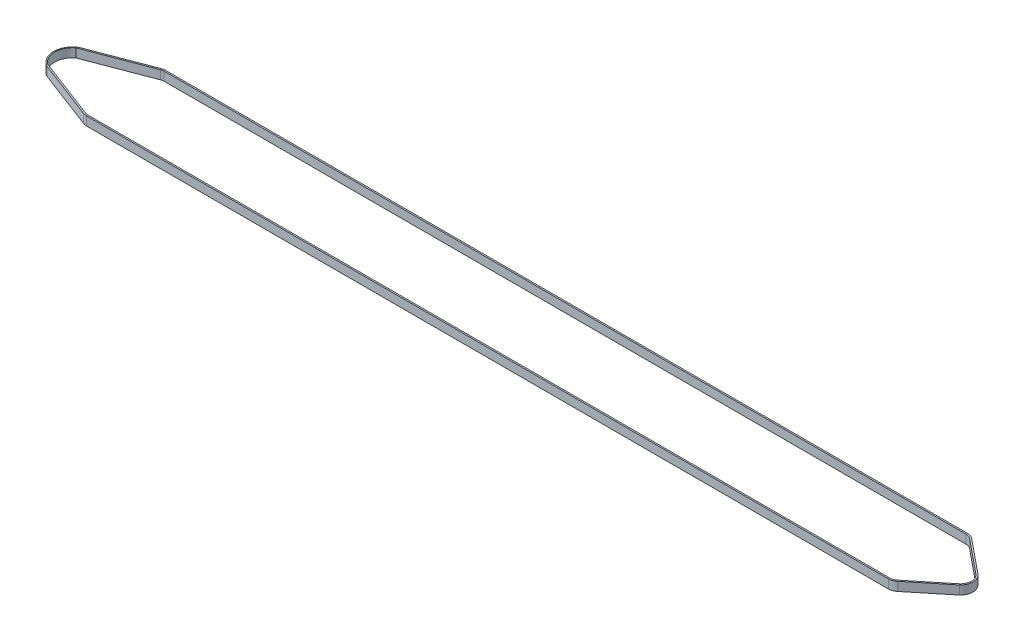
ISO-10303-21;
HEADER;
FILE_DESCRIPTION(('STEP AP214'),'2;1');
FILE_NAME('part.step','',(''),(''),'','','');
FILE_SCHEMA(('AUTOMOTIVE_DESIGN { 1 0 10303 214 1 1 1 1 }'));
ENDSEC;
DATA;
#1=APPLICATION_CONTEXT('core data for automotive mechanical design processes');
#2=APPLICATION_PROTOCOL_DEFINITION('international standard','automotive_design',2000,#1);
#3=PRODUCT_CONTEXT('',#1,'mechanical');
#4=PRODUCT('Part','Part','',(#3));
#5=PRODUCT_RELATED_PRODUCT_CATEGORY('part','',(#4));
#6=PRODUCT_DEFINITION_FORMATION('','',#4);
#7=PRODUCT_DEFINITION_CONTEXT('part definition',#1,'design');
#8=PRODUCT_DEFINITION('design','',#6,#7);
#9=PRODUCT_DEFINITION_SHAPE('','',#8);
#10=(LENGTH_UNIT() NAMED_UNIT(*) SI_UNIT(.MILLI.,.METRE.));
#11=(NAMED_UNIT(*) PLANE_ANGLE_UNIT() SI_UNIT($,.RADIAN.));
#12=(NAMED_UNIT(*) SI_UNIT($,.STERADIAN.) SOLID_ANGLE_UNIT());
#13=UNCERTAINTY_MEASURE_WITH_UNIT(LENGTH_MEASURE(1.E-05),#10,'distance_accuracy_value','');
#14=(GEOMETRIC_REPRESENTATION_CONTEXT(3) GLOBAL_UNCERTAINTY_ASSIGNED_CONTEXT((#13)) GLOBAL_UNIT_ASSIGNED_CONTEXT((#10,
#11,#12)) REPRESENTATION_CONTEXT('',''));
#15=CARTESIAN_POINT('',(0.,0.,0.));
#16=DIRECTION('',(0.,0.,1.));
#17=DIRECTION('',(1.,0.,0.));
#18=AXIS2_PLACEMENT_3D('',#15,#16,#17);
#19=CARTESIAN_POINT('',(-43.9258936534042,6.,-115.210808683554));
#20=DIRECTION('',(0.356250719323577,0.,0.934390402873143));
#21=DIRECTION('',(0.934390402873143,0.,-0.356250719323577));
#22=AXIS2_PLACEMENT_3D('',#19,#20,#21);
#23=PLANE('',#22);
#24=DIRECTION('',(-0.934390402873143,0.,0.356250719323577));
#25=VECTOR('',#24,1.);
#26=CARTESIAN_POINT('',(-43.9258936534042,0.,-115.210808683554));
#27=LINE('',#26,#25);
#28=CARTESIAN_POINT('',(-276.493755035265,0.,-26.540732820112));
#29=VERTEX_POINT('',#28);
#30=CARTESIAN_POINT('',(-317.199927226842,0.,-11.0208782929594));
#31=VERTEX_POINT('',#30);
#32=EDGE_CURVE('E267',#29,#31,#27,.T.);
#33=ORIENTED_EDGE('',*,*,#32,.T.);
#34=DIRECTION('',(0.,-1.,0.));
#35=VECTOR('',#34,1.);
#36=CARTESIAN_POINT('',(-317.199927226842,6.,-11.0208782929594));
#37=LINE('',#36,#35);
#38=CARTESIAN_POINT('',(-317.199927226842,6.,-11.0208782929594));
#39=VERTEX_POINT('',#38);
#40=EDGE_CURVE('E11',#39,#31,#37,.T.);
#41=ORIENTED_EDGE('',*,*,#40,.F.);
#42=DIRECTION('',(-0.934390402873143,0.,0.356250719323577));
#43=VECTOR('',#42,1.);
#44=CARTESIAN_POINT('',(-43.9258936534042,6.,-115.210808683554));
#45=LINE('',#44,#43);
#46=CARTESIAN_POINT('',(-276.493755035265,6.,-26.540732820112));
#47=VERTEX_POINT('',#46);
#48=EDGE_CURVE('E720',#47,#39,#45,.T.);
#49=ORIENTED_EDGE('',*,*,#48,.F.);
#50=DIRECTION('',(0.,-1.,0.));
#51=VECTOR('',#50,1.);
#52=CARTESIAN_POINT('',(-276.493755035265,6.,-26.540732820112));
#53=LINE('',#52,#51);
#54=EDGE_CURVE('E54',#47,#29,#53,.T.);
#55=ORIENTED_EDGE('',*,*,#54,.T.);
#56=EDGE_LOOP('',(#33,#41,#49,#55));
#57=FACE_BOUND('',#56,.T.);
#58=ADVANCED_FACE('F35',(#57),#23,.F.);
#59=CARTESIAN_POINT('',(-310.65,6.,0.));
#60=DIRECTION('',(0.,-1.,0.));
#61=DIRECTION('',(0.,0.,-1.));
#62=AXIS2_PLACEMENT_3D('',#59,#60,#61);
#63=CYLINDRICAL_SURFACE('',#62,12.8203473051688);
#64=CARTESIAN_POINT('',(-310.65,0.,0.));
#65=DIRECTION('',(0.,1.,0.));
#66=DIRECTION('',(0.,0.,1.));
#67=AXIS2_PLACEMENT_3D('',#64,#65,#66);
#68=CIRCLE('',#67,12.8203473051688);
#69=CARTESIAN_POINT('',(-317.199927226842,0.,11.0208782929594));
#70=VERTEX_POINT('',#69);
#71=EDGE_CURVE('E269',#31,#70,#68,.T.);
#72=ORIENTED_EDGE('',*,*,#71,.T.);
#73=DIRECTION('',(0.,-1.,0.));
#74=VECTOR('',#73,1.);
#75=CARTESIAN_POINT('',(-317.199927226842,6.,11.0208782929594));
#76=LINE('',#75,#74);
#77=CARTESIAN_POINT('',(-317.199927226842,6.,11.0208782929594));
#78=VERTEX_POINT('',#77);
#79=EDGE_CURVE('E45',#78,#70,#76,.T.);
#80=ORIENTED_EDGE('',*,*,#79,.F.);
#81=CARTESIAN_POINT('',(-310.65,6.,0.));
#82=DIRECTION('',(0.,1.,0.));
#83=DIRECTION('',(0.,0.,1.));
#84=AXIS2_PLACEMENT_3D('',#81,#82,#83);
#85=CIRCLE('',#84,12.8203473051688);
#86=EDGE_CURVE('E721',#39,#78,#85,.T.);
#87=ORIENTED_EDGE('',*,*,#86,.F.);
#88=ORIENTED_EDGE('',*,*,#40,.T.);
#89=EDGE_LOOP('',(#72,#80,#87,#88));
#90=FACE_BOUND('',#89,.T.);
#91=ADVANCED_FACE('F411',(#90),#63,.T.);
#92=CARTESIAN_POINT('',(-43.9258936534042,6.,115.210808683554));
#93=DIRECTION('',(-0.356250719323577,0.,0.934390402873143));
#94=DIRECTION('',(0.934390402873143,0.,0.356250719323577));
#95=AXIS2_PLACEMENT_3D('',#92,#93,#94);
#96=PLANE('',#95);
#97=DIRECTION('',(-0.934390402873143,0.,-0.356250719323577));
#98=VECTOR('',#97,1.);
#99=CARTESIAN_POINT('',(-43.9258936534042,0.,115.210808683554));
#100=LINE('',#99,#98);
#101=CARTESIAN_POINT('',(-276.493755035265,0.,26.540732820112));
#102=VERTEX_POINT('',#101);
#103=EDGE_CURVE('E272',#102,#70,#100,.T.);
#104=ORIENTED_EDGE('',*,*,#103,.F.);
#105=DIRECTION('',(0.,-1.,0.));
#106=VECTOR('',#105,1.);
#107=CARTESIAN_POINT('',(-276.493755035265,6.,26.540732820112));
#108=LINE('',#107,#106);
#109=CARTESIAN_POINT('',(-276.493755035265,6.,26.540732820112));
#110=VERTEX_POINT('',#109);
#111=EDGE_CURVE('E313',#110,#102,#108,.T.);
#112=ORIENTED_EDGE('',*,*,#111,.F.);
#113=DIRECTION('',(-0.934390402873143,0.,-0.356250719323577));
#114=VECTOR('',#113,1.);
#115=CARTESIAN_POINT('',(-43.9258936534042,6.,115.210808683554));
#116=LINE('',#115,#114);
#117=EDGE_CURVE('E710',#110,#78,#116,.T.);
#118=ORIENTED_EDGE('',*,*,#117,.T.);
#119=ORIENTED_EDGE('',*,*,#79,.T.);
#120=EDGE_LOOP('',(#104,#112,#118,#119));
#121=FACE_BOUND('',#120,.T.);
#122=ADVANCED_FACE('F416',(#121),#96,.T.);
#123=CARTESIAN_POINT('',(-274.,6.,20.));
#124=DIRECTION('',(0.,-1.,0.));
#125=DIRECTION('',(0.,0.,-1.));
#126=AXIS2_PLACEMENT_3D('',#123,#124,#125);
#127=CYLINDRICAL_SURFACE('',#126,6.99999999999998);
#128=CARTESIAN_POINT('',(-274.,0.,20.));
#129=DIRECTION('',(0.,1.,0.));
#130=DIRECTION('',(0.,0.,1.));
#131=AXIS2_PLACEMENT_3D('',#128,#129,#130);
#132=CIRCLE('',#131,6.99999999999998);
#133=CARTESIAN_POINT('',(-274.,0.,27.));
#134=VERTEX_POINT('',#133);
#135=EDGE_CURVE('E275',#102,#134,#132,.T.);
#136=ORIENTED_EDGE('',*,*,#135,.T.);
#137=DIRECTION('',(0.,-1.,0.));
#138=VECTOR('',#137,1.);
#139=CARTESIAN_POINT('',(-274.,6.,27.));
#140=LINE('',#139,#138);
#141=CARTESIAN_POINT('',(-274.,6.,27.));
#142=VERTEX_POINT('',#141);
#143=EDGE_CURVE('E310',#142,#134,#140,.T.);
#144=ORIENTED_EDGE('',*,*,#143,.F.);
#145=CARTESIAN_POINT('',(-274.,6.,20.));
#146=DIRECTION('',(0.,1.,0.));
#147=DIRECTION('',(0.,0.,1.));
#148=AXIS2_PLACEMENT_3D('',#145,#146,#147);
#149=CIRCLE('',#148,6.99999999999998);
#150=EDGE_CURVE('E706',#110,#142,#149,.T.);
#151=ORIENTED_EDGE('',*,*,#150,.F.);
#152=ORIENTED_EDGE('',*,*,#111,.T.);
#153=EDGE_LOOP('',(#136,#144,#151,#152));
#154=FACE_BOUND('',#153,.T.);
#155=ADVANCED_FACE('F654',(#154),#127,.T.);
#156=CARTESIAN_POINT('',(0.,6.,27.));
#157=DIRECTION('',(0.,0.,-1.));
#158=DIRECTION('',(-1.,0.,0.));
#159=AXIS2_PLACEMENT_3D('',#156,#157,#158);
#160=PLANE('',#159);
#161=DIRECTION('',(1.,0.,0.));
#162=VECTOR('',#161,1.);
#163=CARTESIAN_POINT('',(0.,0.,27.));
#164=LINE('',#163,#162);
#165=CARTESIAN_POINT('',(274.,0.,27.));
#166=VERTEX_POINT('',#165);
#167=EDGE_CURVE('E277',#134,#166,#164,.T.);
#168=ORIENTED_EDGE('',*,*,#167,.T.);
#169=DIRECTION('',(0.,-1.,0.));
#170=VECTOR('',#169,1.);
#171=CARTESIAN_POINT('',(274.,6.,27.));
#172=LINE('',#171,#170);
#173=CARTESIAN_POINT('',(274.,6.,27.));
#174=VERTEX_POINT('',#173);
#175=EDGE_CURVE('E307',#174,#166,#172,.T.);
#176=ORIENTED_EDGE('',*,*,#175,.F.);
#177=DIRECTION('',(1.,0.,0.));
#178=VECTOR('',#177,1.);
#179=CARTESIAN_POINT('',(0.,6.,27.));
#180=LINE('',#179,#178);
#181=EDGE_CURVE('E703',#142,#174,#180,.T.);
#182=ORIENTED_EDGE('',*,*,#181,.F.);
#183=ORIENTED_EDGE('',*,*,#143,.T.);
#184=EDGE_LOOP('',(#168,#176,#182,#183));
#185=FACE_BOUND('',#184,.T.);
#186=ADVANCED_FACE('F645',(#185),#160,.F.);
#187=CARTESIAN_POINT('',(274.,6.,20.));
#188=DIRECTION('',(0.,-1.,0.));
#189=DIRECTION('',(0.,0.,-1.));
#190=AXIS2_PLACEMENT_3D('',#187,#188,#189);
#191=CYLINDRICAL_SURFACE('',#190,7.00000000000001);
#192=CARTESIAN_POINT('',(274.,0.,20.));
#193=DIRECTION('',(0.,1.,0.));
#194=DIRECTION('',(0.,0.,1.));
#195=AXIS2_PLACEMENT_3D('',#192,#193,#194);
#196=CIRCLE('',#195,7.00000000000001);
#197=CARTESIAN_POINT('',(278.684110580425,0.,25.2018369899828));
#198=VERTEX_POINT('',#197);
#199=EDGE_CURVE('E279',#166,#198,#196,.T.);
#200=ORIENTED_EDGE('',*,*,#199,.T.);
#201=DIRECTION('',(0.,-1.,0.));
#202=VECTOR('',#201,1.);
#203=CARTESIAN_POINT('',(278.684110580425,6.,25.2018369899828));
#204=LINE('',#203,#202);
#205=CARTESIAN_POINT('',(278.684110580425,6.,25.2018369899828));
#206=VERTEX_POINT('',#205);
#207=EDGE_CURVE('E304',#206,#198,#204,.T.);
#208=ORIENTED_EDGE('',*,*,#207,.F.);
#209=CARTESIAN_POINT('',(274.,6.,20.));
#210=DIRECTION('',(0.,1.,0.));
#211=DIRECTION('',(0.,0.,1.));
#212=AXIS2_PLACEMENT_3D('',#209,#210,#211);
#213=CIRCLE('',#212,7.00000000000001);
#214=EDGE_CURVE('E705',#174,#206,#213,.T.);
#215=ORIENTED_EDGE('',*,*,#214,.F.);
#216=ORIENTED_EDGE('',*,*,#175,.T.);
#217=EDGE_LOOP('',(#200,#208,#215,#216));
#218=FACE_BOUND('',#217,.T.);
#219=ADVANCED_FACE('F636',(#218),#191,.T.);
#220=CARTESIAN_POINT('',(123.443459339254,6.,151.605329094822));
#221=DIRECTION('',(-0.631406061283673,0.,-0.775452374923334));
#222=DIRECTION('',(-0.775452374923334,0.,0.631406061283673));
#223=AXIS2_PLACEMENT_3D('',#220,#221,#222);
#224=PLANE('',#223);
#225=DIRECTION('',(0.775452374923334,0.,-0.631406061283673));
#226=VECTOR('',#225,1.);
#227=CARTESIAN_POINT('',(123.443459339254,0.,151.605329094822));
#228=LINE('',#227,#226);
#229=CARTESIAN_POINT('',(301.877848561944,0.,6.31651634497923));
#230=VERTEX_POINT('',#229);
#231=EDGE_CURVE('E281',#198,#230,#228,.T.);
#232=ORIENTED_EDGE('',*,*,#231,.T.);
#233=DIRECTION('',(0.,-1.,0.));
#234=VECTOR('',#233,1.);
#235=CARTESIAN_POINT('',(301.877848561944,6.,6.31651634497923));
#236=LINE('',#235,#234);
#237=CARTESIAN_POINT('',(301.877848561944,6.,6.31651634497923));
#238=VERTEX_POINT('',#237);
#239=EDGE_CURVE('E301',#238,#230,#236,.T.);
#240=ORIENTED_EDGE('',*,*,#239,.F.);
#241=DIRECTION('',(0.775452374923334,0.,-0.631406061283673));
#242=VECTOR('',#241,1.);
#243=CARTESIAN_POINT('',(123.443459339254,6.,151.605329094822));
#244=LINE('',#243,#242);
#245=EDGE_CURVE('E708',#206,#238,#244,.T.);
#246=ORIENTED_EDGE('',*,*,#245,.F.);
#247=ORIENTED_EDGE('',*,*,#207,.T.);
#248=EDGE_LOOP('',(#232,#240,#246,#247));
#249=FACE_BOUND('',#248,.T.);
#250=ADVANCED_FACE('F627',(#249),#224,.F.);
#251=CARTESIAN_POINT('',(296.19,6.,0.));
#252=DIRECTION('',(0.,-1.,0.));
#253=DIRECTION('',(0.,0.,-1.));
#254=AXIS2_PLACEMENT_3D('',#251,#252,#253);
#255=CYLINDRICAL_SURFACE('',#254,8.50000000000002);
#256=CARTESIAN_POINT('',(296.19,0.,0.));
#257=DIRECTION('',(0.,1.,0.));
#258=DIRECTION('',(0.,0.,1.));
#259=AXIS2_PLACEMENT_3D('',#256,#257,#258);
#260=CIRCLE('',#259,8.50000000000002);
#261=CARTESIAN_POINT('',(301.877848561944,0.,-6.31651634497923));
#262=VERTEX_POINT('',#261);
#263=EDGE_CURVE('E283',#230,#262,#260,.T.);
#264=ORIENTED_EDGE('',*,*,#263,.T.);
#265=DIRECTION('',(0.,-1.,0.));
#266=VECTOR('',#265,1.);
#267=CARTESIAN_POINT('',(301.877848561944,6.,-6.31651634497923));
#268=LINE('',#267,#266);
#269=CARTESIAN_POINT('',(301.877848561944,6.,-6.31651634497923));
#270=VERTEX_POINT('',#269);
#271=EDGE_CURVE('E299',#270,#262,#268,.T.);
#272=ORIENTED_EDGE('',*,*,#271,.F.);
#273=CARTESIAN_POINT('',(296.19,6.,0.));
#274=DIRECTION('',(0.,1.,0.));
#275=DIRECTION('',(0.,0.,1.));
#276=AXIS2_PLACEMENT_3D('',#273,#274,#275);
#277=CIRCLE('',#276,8.50000000000002);
#278=EDGE_CURVE('E715',#238,#270,#277,.T.);
#279=ORIENTED_EDGE('',*,*,#278,.F.);
#280=ORIENTED_EDGE('',*,*,#239,.T.);
#281=EDGE_LOOP('',(#264,#272,#279,#280));
#282=FACE_BOUND('',#281,.T.);
#283=ADVANCED_FACE('F618',(#282),#255,.T.);
#284=CARTESIAN_POINT('',(123.443459339254,6.,-151.605329094822));
#285=DIRECTION('',(0.631406061283673,0.,-0.775452374923334));
#286=DIRECTION('',(-0.775452374923334,0.,-0.631406061283673));
#287=AXIS2_PLACEMENT_3D('',#284,#285,#286);
#288=PLANE('',#287);
#289=DIRECTION('',(0.775452374923334,0.,0.631406061283673));
#290=VECTOR('',#289,1.);
#291=CARTESIAN_POINT('',(123.443459339254,0.,-151.605329094822));
#292=LINE('',#291,#290);
#293=CARTESIAN_POINT('',(278.684110580425,0.,-25.2018369899828));
#294=VERTEX_POINT('',#293);
#295=EDGE_CURVE('E286',#294,#262,#292,.T.);
#296=ORIENTED_EDGE('',*,*,#295,.F.);
#297=DIRECTION('',(0.,-1.,0.));
#298=VECTOR('',#297,1.);
#299=CARTESIAN_POINT('',(278.684110580425,6.,-25.2018369899828));
#300=LINE('',#299,#298);
#301=CARTESIAN_POINT('',(278.684110580425,6.,-25.2018369899828));
#302=VERTEX_POINT('',#301);
#303=EDGE_CURVE('E223',#302,#294,#300,.T.);
#304=ORIENTED_EDGE('',*,*,#303,.F.);
#305=DIRECTION('',(0.775452374923334,0.,0.631406061283673));
#306=VECTOR('',#305,1.);
#307=CARTESIAN_POINT('',(123.443459339254,6.,-151.605329094822));
#308=LINE('',#307,#306);
#309=EDGE_CURVE('E213',#302,#270,#308,.T.);
#310=ORIENTED_EDGE('',*,*,#309,.T.);
#311=ORIENTED_EDGE('',*,*,#271,.T.);
#312=EDGE_LOOP('',(#296,#304,#310,#311));
#313=FACE_BOUND('',#312,.T.);
#314=ADVANCED_FACE('F610',(#313),#288,.T.);
#315=CARTESIAN_POINT('',(274.,6.,-20.));
#316=DIRECTION('',(0.,-1.,0.));
#317=DIRECTION('',(0.,0.,-1.));
#318=AXIS2_PLACEMENT_3D('',#315,#316,#317);
#319=CYLINDRICAL_SURFACE('',#318,7.00000000000001);
#320=CARTESIAN_POINT('',(274.,0.,-20.));
#321=DIRECTION('',(0.,1.,0.));
#322=DIRECTION('',(0.,0.,1.));
#323=AXIS2_PLACEMENT_3D('',#320,#321,#322);
#324=CIRCLE('',#323,7.00000000000001);
#325=CARTESIAN_POINT('',(274.,0.,-27.));
#326=VERTEX_POINT('',#325);
#327=EDGE_CURVE('E220',#294,#326,#324,.T.);
#328=ORIENTED_EDGE('',*,*,#327,.T.);
#329=DIRECTION('',(0.,-1.,0.));
#330=VECTOR('',#329,1.);
#331=CARTESIAN_POINT('',(274.,6.,-27.));
#332=LINE('',#331,#330);
#333=CARTESIAN_POINT('',(274.,6.,-27.));
#334=VERTEX_POINT('',#333);
#335=EDGE_CURVE('E217',#334,#326,#332,.T.);
#336=ORIENTED_EDGE('',*,*,#335,.F.);
#337=CARTESIAN_POINT('',(274.,6.,-20.));
#338=DIRECTION('',(0.,1.,0.));
#339=DIRECTION('',(0.,0.,1.));
#340=AXIS2_PLACEMENT_3D('',#337,#338,#339);
#341=CIRCLE('',#340,7.00000000000001);
#342=EDGE_CURVE('E205',#302,#334,#341,.T.);
#343=ORIENTED_EDGE('',*,*,#342,.F.);
#344=ORIENTED_EDGE('',*,*,#303,.T.);
#345=EDGE_LOOP('',(#328,#336,#343,#344));
#346=FACE_BOUND('',#345,.T.);
#347=ADVANCED_FACE('F218',(#346),#319,.T.);
#348=CARTESIAN_POINT('',(0.,6.,-27.));
#349=DIRECTION('',(0.,0.,-1.));
#350=DIRECTION('',(-1.,0.,0.));
#351=AXIS2_PLACEMENT_3D('',#348,#349,#350);
#352=PLANE('',#351);
#353=DIRECTION('',(1.,0.,0.));
#354=VECTOR('',#353,1.);
#355=CARTESIAN_POINT('',(0.,0.,-27.));
#356=LINE('',#355,#354);
#357=CARTESIAN_POINT('',(-274.,0.,-27.));
#358=VERTEX_POINT('',#357);
#359=EDGE_CURVE('E290',#358,#326,#356,.T.);
#360=ORIENTED_EDGE('',*,*,#359,.F.);
#361=DIRECTION('',(0.,-1.,0.));
#362=VECTOR('',#361,1.);
#363=CARTESIAN_POINT('',(-274.,6.,-27.));
#364=LINE('',#363,#362);
#365=CARTESIAN_POINT('',(-274.,6.,-27.));
#366=VERTEX_POINT('',#365);
#367=EDGE_CURVE('E128',#366,#358,#364,.T.);
#368=ORIENTED_EDGE('',*,*,#367,.F.);
#369=DIRECTION('',(1.,0.,0.));
#370=VECTOR('',#369,1.);
#371=CARTESIAN_POINT('',(0.,6.,-27.));
#372=LINE('',#371,#370);
#373=EDGE_CURVE('E211',#366,#334,#372,.T.);
#374=ORIENTED_EDGE('',*,*,#373,.T.);
#375=ORIENTED_EDGE('',*,*,#335,.T.);
#376=EDGE_LOOP('',(#360,#368,#374,#375));
#377=FACE_BOUND('',#376,.T.);
#378=ADVANCED_FACE('F225',(#377),#352,.T.);
#379=CARTESIAN_POINT('',(-310.65,6.,0.));
#380=DIRECTION('',(0.,-1.,0.));
#381=DIRECTION('',(0.,0.,-1.));
#382=AXIS2_PLACEMENT_3D('',#379,#380,#381);
#383=CYLINDRICAL_SURFACE('',#382,12.1364229834209);
#384=CARTESIAN_POINT('',(-310.65,0.,0.));
#385=DIRECTION('',(0.,1.,0.));
#386=DIRECTION('',(0.,0.,1.));
#387=AXIS2_PLACEMENT_3D('',#384,#385,#386);
#388=CIRCLE('',#387,12.1364229834209);
#389=CARTESIAN_POINT('',(-318.031465246949,0.,-9.63362515570308));
#390=VERTEX_POINT('',#389);
#391=CARTESIAN_POINT('',(-318.031465246949,0.,9.63362515570308));
#392=VERTEX_POINT('',#391);
#393=EDGE_CURVE('E232',#390,#392,#388,.T.);
#394=ORIENTED_EDGE('',*,*,#393,.F.);
#395=DIRECTION('',(0.,-1.,0.));
#396=VECTOR('',#395,1.);
#397=CARTESIAN_POINT('',(-318.031465246949,6.,-9.63362515570308));
#398=LINE('',#397,#396);
#399=CARTESIAN_POINT('',(-318.031465246949,6.,-9.63362515570308));
#400=VERTEX_POINT('',#399);
#401=EDGE_CURVE('E39',#400,#390,#398,.T.);
#402=ORIENTED_EDGE('',*,*,#401,.F.);
#403=CARTESIAN_POINT('',(-310.65,6.,0.));
#404=DIRECTION('',(0.,1.,0.));
#405=DIRECTION('',(0.,0.,1.));
#406=AXIS2_PLACEMENT_3D('',#403,#404,#405);
#407=CIRCLE('',#406,12.1364229834209);
#408=CARTESIAN_POINT('',(-318.031465246949,6.,9.63362515570308));
#409=VERTEX_POINT('',#408);
#410=EDGE_CURVE('E295',#400,#409,#407,.T.);
#411=ORIENTED_EDGE('',*,*,#410,.T.);
#412=DIRECTION('',(0.,-1.,0.));
#413=VECTOR('',#412,1.);
#414=CARTESIAN_POINT('',(-318.031465246949,6.,9.63362515570308));
#415=LINE('',#414,#413);
#416=EDGE_CURVE('E228',#409,#392,#415,.T.);
#417=ORIENTED_EDGE('',*,*,#416,.T.);
#418=EDGE_LOOP('',(#394,#402,#411,#417));
#419=FACE_BOUND('',#418,.T.);
#420=ADVANCED_FACE('F37',(#419),#383,.F.);
#421=CARTESIAN_POINT('',(-43.5696429340805,6.,-114.276418280681));
#422=DIRECTION('',(-0.356250719323576,0.,-0.934390402873143));
#423=DIRECTION('',(-0.934390402873143,0.,0.356250719323577));
#424=AXIS2_PLACEMENT_3D('',#421,#422,#423);
#425=PLANE('',#424);
#426=DIRECTION('',(0.934390402873143,0.,-0.356250719323577));
#427=VECTOR('',#426,1.);
#428=CARTESIAN_POINT('',(-43.5696429340805,0.,-114.276418280681));
#429=LINE('',#428,#427);
#430=CARTESIAN_POINT('',(-276.137504315942,0.,-25.6063424172388));
#431=VERTEX_POINT('',#430);
#432=EDGE_CURVE('E235',#390,#431,#429,.T.);
#433=ORIENTED_EDGE('',*,*,#432,.T.);
#434=DIRECTION('',(0.,-1.,0.));
#435=VECTOR('',#434,1.);
#436=CARTESIAN_POINT('',(-276.137504315942,6.,-25.6063424172388));
#437=LINE('',#436,#435);
#438=CARTESIAN_POINT('',(-276.137504315942,6.,-25.6063424172388));
#439=VERTEX_POINT('',#438);
#440=EDGE_CURVE('E334',#439,#431,#437,.T.);
#441=ORIENTED_EDGE('',*,*,#440,.F.);
#442=DIRECTION('',(0.934390402873143,0.,-0.356250719323577));
#443=VECTOR('',#442,1.);
#444=CARTESIAN_POINT('',(-43.5696429340805,6.,-114.276418280681));
#445=LINE('',#444,#443);
#446=EDGE_CURVE('E343',#400,#439,#445,.T.);
#447=ORIENTED_EDGE('',*,*,#446,.F.);
#448=ORIENTED_EDGE('',*,*,#401,.T.);
#449=EDGE_LOOP('',(#433,#441,#447,#448));
#450=FACE_BOUND('',#449,.T.);
#451=ADVANCED_FACE('F342',(#450),#425,.F.);
#452=CARTESIAN_POINT('',(-274.,6.,-20.));
#453=DIRECTION('',(0.,-1.,0.));
#454=DIRECTION('',(0.,0.,-1.));
#455=AXIS2_PLACEMENT_3D('',#452,#453,#454);
#456=CYLINDRICAL_SURFACE('',#455,5.99999999999999);
#457=CARTESIAN_POINT('',(-274.,0.,-20.));
#458=DIRECTION('',(0.,1.,0.));
#459=DIRECTION('',(0.,0.,1.));
#460=AXIS2_PLACEMENT_3D('',#457,#458,#459);
#461=CIRCLE('',#460,5.99999999999999);
#462=CARTESIAN_POINT('',(-274.,0.,-26.));
#463=VERTEX_POINT('',#462);
#464=EDGE_CURVE('E237',#431,#463,#461,.F.);
#465=ORIENTED_EDGE('',*,*,#464,.T.);
#466=DIRECTION('',(0.,-1.,0.));
#467=VECTOR('',#466,1.);
#468=CARTESIAN_POINT('',(-274.,6.,-26.));
#469=LINE('',#468,#467);
#470=CARTESIAN_POINT('',(-274.,6.,-26.));
#471=VERTEX_POINT('',#470);
#472=EDGE_CURVE('E333',#471,#463,#469,.T.);
#473=ORIENTED_EDGE('',*,*,#472,.F.);
#474=CARTESIAN_POINT('',(-274.,6.,-20.));
#475=DIRECTION('',(0.,1.,0.));
#476=DIRECTION('',(0.,0.,1.));
#477=AXIS2_PLACEMENT_3D('',#474,#475,#476);
#478=CIRCLE('',#477,5.99999999999999);
#479=EDGE_CURVE('E736',#439,#471,#478,.F.);
#480=ORIENTED_EDGE('',*,*,#479,.F.);
#481=ORIENTED_EDGE('',*,*,#440,.T.);
#482=EDGE_LOOP('',(#465,#473,#480,#481));
#483=FACE_BOUND('',#482,.T.);
#484=ADVANCED_FACE('F402',(#483),#456,.F.);
#485=CARTESIAN_POINT('',(0.,6.,-26.));
#486=DIRECTION('',(0.,0.,1.));
#487=DIRECTION('',(1.,0.,0.));
#488=AXIS2_PLACEMENT_3D('',#485,#486,#487);
#489=PLANE('',#488);
#490=DIRECTION('',(-1.,0.,0.));
#491=VECTOR('',#490,1.);
#492=CARTESIAN_POINT('',(0.,0.,-26.));
#493=LINE('',#492,#491);
#494=CARTESIAN_POINT('',(274.,0.,-26.));
#495=VERTEX_POINT('',#494);
#496=EDGE_CURVE('E240',#495,#463,#493,.T.);
#497=ORIENTED_EDGE('',*,*,#496,.F.);
#498=DIRECTION('',(0.,-1.,0.));
#499=VECTOR('',#498,1.);
#500=CARTESIAN_POINT('',(274.,6.,-26.));
#501=LINE('',#500,#499);
#502=CARTESIAN_POINT('',(274.,6.,-26.));
#503=VERTEX_POINT('',#502);
#504=EDGE_CURVE('E331',#503,#495,#501,.T.);
#505=ORIENTED_EDGE('',*,*,#504,.F.);
#506=DIRECTION('',(-1.,0.,0.));
#507=VECTOR('',#506,1.);
#508=CARTESIAN_POINT('',(0.,6.,-26.));
#509=LINE('',#508,#507);
#510=EDGE_CURVE('E401',#503,#471,#509,.T.);
#511=ORIENTED_EDGE('',*,*,#510,.T.);
#512=ORIENTED_EDGE('',*,*,#472,.T.);
#513=EDGE_LOOP('',(#497,#505,#511,#512));
#514=FACE_BOUND('',#513,.T.);
#515=ADVANCED_FACE('F399',(#514),#489,.T.);
#516=CARTESIAN_POINT('',(274.,6.,-20.));
#517=DIRECTION('',(0.,-1.,0.));
#518=DIRECTION('',(0.,0.,-1.));
#519=AXIS2_PLACEMENT_3D('',#516,#517,#518);
#520=CYLINDRICAL_SURFACE('',#519,5.99999999999996);
#521=CARTESIAN_POINT('',(274.,0.,-20.));
#522=DIRECTION('',(0.,1.,0.));
#523=DIRECTION('',(0.,0.,1.));
#524=AXIS2_PLACEMENT_3D('',#521,#522,#523);
#525=CIRCLE('',#524,5.99999999999996);
#526=CARTESIAN_POINT('',(278.014951926078,0.,-24.4587174199852));
#527=VERTEX_POINT('',#526);
#528=EDGE_CURVE('E243',#527,#495,#525,.T.);
#529=ORIENTED_EDGE('',*,*,#528,.F.);
#530=DIRECTION('',(0.,-1.,0.));
#531=VECTOR('',#530,1.);
#532=CARTESIAN_POINT('',(278.014951926078,6.,-24.4587174199852));
#533=LINE('',#532,#531);
#534=CARTESIAN_POINT('',(278.014951926078,6.,-24.4587174199852));
#535=VERTEX_POINT('',#534);
#536=EDGE_CURVE('E329',#535,#527,#533,.T.);
#537=ORIENTED_EDGE('',*,*,#536,.F.);
#538=CARTESIAN_POINT('',(274.,6.,-20.));
#539=DIRECTION('',(0.,1.,0.));
#540=DIRECTION('',(0.,0.,1.));
#541=AXIS2_PLACEMENT_3D('',#538,#539,#540);
#542=CIRCLE('',#541,5.99999999999996);
#543=EDGE_CURVE('E395',#535,#503,#542,.T.);
#544=ORIENTED_EDGE('',*,*,#543,.T.);
#545=ORIENTED_EDGE('',*,*,#504,.T.);
#546=EDGE_LOOP('',(#529,#537,#544,#545));
#547=FACE_BOUND('',#546,.T.);
#548=ADVANCED_FACE('F391',(#547),#520,.F.);
#549=CARTESIAN_POINT('',(122.812833275521,6.,-150.830834662798));
#550=DIRECTION('',(0.631406061283672,0.,-0.775452374923335));
#551=DIRECTION('',(-0.775452374923335,0.,-0.631406061283672));
#552=AXIS2_PLACEMENT_3D('',#549,#550,#551);
#553=PLANE('',#552);
#554=DIRECTION('',(0.775452374923335,0.,0.631406061283672));
#555=VECTOR('',#554,1.);
#556=CARTESIAN_POINT('',(122.812833275521,0.,-150.830834662798));
#557=LINE('',#556,#555);
#558=CARTESIAN_POINT('',(301.208689907598,0.,-5.57339677498161));
#559=VERTEX_POINT('',#558);
#560=EDGE_CURVE('E246',#527,#559,#557,.T.);
#561=ORIENTED_EDGE('',*,*,#560,.T.);
#562=DIRECTION('',(0.,-1.,0.));
#563=VECTOR('',#562,1.);
#564=CARTESIAN_POINT('',(301.208689907598,6.,-5.57339677498161));
#565=LINE('',#564,#563);
#566=CARTESIAN_POINT('',(301.208689907598,6.,-5.57339677498161));
#567=VERTEX_POINT('',#566);
#568=EDGE_CURVE('E327',#567,#559,#565,.T.);
#569=ORIENTED_EDGE('',*,*,#568,.F.);
#570=DIRECTION('',(0.775452374923335,0.,0.631406061283672));
#571=VECTOR('',#570,1.);
#572=CARTESIAN_POINT('',(122.812833275521,6.,-150.830834662798));
#573=LINE('',#572,#571);
#574=EDGE_CURVE('E732',#535,#567,#573,.T.);
#575=ORIENTED_EDGE('',*,*,#574,.F.);
#576=ORIENTED_EDGE('',*,*,#536,.T.);
#577=EDGE_LOOP('',(#561,#569,#575,#576));
#578=FACE_BOUND('',#577,.T.);
#579=ADVANCED_FACE('F388',(#578),#553,.F.);
#580=CARTESIAN_POINT('',(296.19,6.,0.));
#581=DIRECTION('',(0.,-1.,0.));
#582=DIRECTION('',(0.,0.,-1.));
#583=AXIS2_PLACEMENT_3D('',#580,#581,#582);
#584=CYLINDRICAL_SURFACE('',#583,7.50000000000001);
#585=CARTESIAN_POINT('',(296.19,0.,0.));
#586=DIRECTION('',(0.,1.,0.));
#587=DIRECTION('',(0.,0.,1.));
#588=AXIS2_PLACEMENT_3D('',#585,#586,#587);
#589=CIRCLE('',#588,7.50000000000001);
#590=CARTESIAN_POINT('',(301.208689907598,0.,5.57339677498161));
#591=VERTEX_POINT('',#590);
#592=EDGE_CURVE('E249',#591,#559,#589,.T.);
#593=ORIENTED_EDGE('',*,*,#592,.F.);
#594=DIRECTION('',(0.,-1.,0.));
#595=VECTOR('',#594,1.);
#596=CARTESIAN_POINT('',(301.208689907598,6.,5.57339677498161));
#597=LINE('',#596,#595);
#598=CARTESIAN_POINT('',(301.208689907598,6.,5.57339677498161));
#599=VERTEX_POINT('',#598);
#600=EDGE_CURVE('E325',#599,#591,#597,.T.);
#601=ORIENTED_EDGE('',*,*,#600,.F.);
#602=CARTESIAN_POINT('',(296.19,6.,0.));
#603=DIRECTION('',(0.,1.,0.));
#604=DIRECTION('',(0.,0.,1.));
#605=AXIS2_PLACEMENT_3D('',#602,#603,#604);
#606=CIRCLE('',#605,7.50000000000001);
#607=EDGE_CURVE('E385',#599,#567,#606,.T.);
#608=ORIENTED_EDGE('',*,*,#607,.T.);
#609=ORIENTED_EDGE('',*,*,#568,.T.);
#610=EDGE_LOOP('',(#593,#601,#608,#609));
#611=FACE_BOUND('',#610,.T.);
#612=ADVANCED_FACE('F383',(#611),#584,.F.);
#613=CARTESIAN_POINT('',(122.812833275521,6.,150.830834662798));
#614=DIRECTION('',(-0.631406061283672,0.,-0.775452374923335));
#615=DIRECTION('',(-0.775452374923335,0.,0.631406061283672));
#616=AXIS2_PLACEMENT_3D('',#613,#614,#615);
#617=PLANE('',#616);
#618=DIRECTION('',(0.775452374923335,0.,-0.631406061283672));
#619=VECTOR('',#618,1.);
#620=CARTESIAN_POINT('',(122.812833275521,0.,150.830834662798));
#621=LINE('',#620,#619);
#622=CARTESIAN_POINT('',(278.014951926078,0.,24.4587174199852));
#623=VERTEX_POINT('',#622);
#624=EDGE_CURVE('E252',#623,#591,#621,.T.);
#625=ORIENTED_EDGE('',*,*,#624,.F.);
#626=DIRECTION('',(0.,-1.,0.));
#627=VECTOR('',#626,1.);
#628=CARTESIAN_POINT('',(278.014951926078,6.,24.4587174199852));
#629=LINE('',#628,#627);
#630=CARTESIAN_POINT('',(278.014951926078,6.,24.4587174199852));
#631=VERTEX_POINT('',#630);
#632=EDGE_CURVE('E323',#631,#623,#629,.T.);
#633=ORIENTED_EDGE('',*,*,#632,.F.);
#634=DIRECTION('',(0.775452374923335,0.,-0.631406061283672));
#635=VECTOR('',#634,1.);
#636=CARTESIAN_POINT('',(122.812833275521,6.,150.830834662798));
#637=LINE('',#636,#635);
#638=EDGE_CURVE('E379',#631,#599,#637,.T.);
#639=ORIENTED_EDGE('',*,*,#638,.T.);
#640=ORIENTED_EDGE('',*,*,#600,.T.);
#641=EDGE_LOOP('',(#625,#633,#639,#640));
#642=FACE_BOUND('',#641,.T.);
#643=ADVANCED_FACE('F376',(#642),#617,.T.);
#644=CARTESIAN_POINT('',(274.,6.,20.));
#645=DIRECTION('',(0.,-1.,0.));
#646=DIRECTION('',(0.,0.,-1.));
#647=AXIS2_PLACEMENT_3D('',#644,#645,#646);
#648=CYLINDRICAL_SURFACE('',#647,5.99999999999996);
#649=CARTESIAN_POINT('',(274.,0.,20.));
#650=DIRECTION('',(0.,1.,0.));
#651=DIRECTION('',(0.,0.,1.));
#652=AXIS2_PLACEMENT_3D('',#649,#650,#651);
#653=CIRCLE('',#652,5.99999999999996);
#654=CARTESIAN_POINT('',(274.,0.,26.));
#655=VERTEX_POINT('',#654);
#656=EDGE_CURVE('E255',#655,#623,#653,.T.);
#657=ORIENTED_EDGE('',*,*,#656,.F.);
#658=DIRECTION('',(0.,-1.,0.));
#659=VECTOR('',#658,1.);
#660=CARTESIAN_POINT('',(274.,6.,26.));
#661=LINE('',#660,#659);
#662=CARTESIAN_POINT('',(274.,6.,26.));
#663=VERTEX_POINT('',#662);
#664=EDGE_CURVE('E321',#663,#655,#661,.T.);
#665=ORIENTED_EDGE('',*,*,#664,.F.);
#666=CARTESIAN_POINT('',(274.,6.,20.));
#667=DIRECTION('',(0.,1.,0.));
#668=DIRECTION('',(0.,0.,1.));
#669=AXIS2_PLACEMENT_3D('',#666,#667,#668);
#670=CIRCLE('',#669,5.99999999999996);
#671=EDGE_CURVE('E371',#663,#631,#670,.T.);
#672=ORIENTED_EDGE('',*,*,#671,.T.);
#673=ORIENTED_EDGE('',*,*,#632,.T.);
#674=EDGE_LOOP('',(#657,#665,#672,#673));
#675=FACE_BOUND('',#674,.T.);
#676=ADVANCED_FACE('F370',(#675),#648,.F.);
#677=CARTESIAN_POINT('',(0.,6.,26.));
#678=DIRECTION('',(0.,0.,1.));
#679=DIRECTION('',(1.,0.,0.));
#680=AXIS2_PLACEMENT_3D('',#677,#678,#679);
#681=PLANE('',#680);
#682=DIRECTION('',(-1.,0.,0.));
#683=VECTOR('',#682,1.);
#684=CARTESIAN_POINT('',(0.,0.,26.));
#685=LINE('',#684,#683);
#686=CARTESIAN_POINT('',(-274.,0.,26.));
#687=VERTEX_POINT('',#686);
#688=EDGE_CURVE('E258',#655,#687,#685,.T.);
#689=ORIENTED_EDGE('',*,*,#688,.T.);
#690=DIRECTION('',(0.,-1.,0.));
#691=VECTOR('',#690,1.);
#692=CARTESIAN_POINT('',(-274.,6.,26.));
#693=LINE('',#692,#691);
#694=CARTESIAN_POINT('',(-274.,6.,26.));
#695=VERTEX_POINT('',#694);
#696=EDGE_CURVE('E319',#695,#687,#693,.T.);
#697=ORIENTED_EDGE('',*,*,#696,.F.);
#698=DIRECTION('',(-1.,0.,0.));
#699=VECTOR('',#698,1.);
#700=CARTESIAN_POINT('',(0.,6.,26.));
#701=LINE('',#700,#699);
#702=EDGE_CURVE('E366',#663,#695,#701,.T.);
#703=ORIENTED_EDGE('',*,*,#702,.F.);
#704=ORIENTED_EDGE('',*,*,#664,.T.);
#705=EDGE_LOOP('',(#689,#697,#703,#704));
#706=FACE_BOUND('',#705,.T.);
#707=ADVANCED_FACE('F365',(#706),#681,.F.);
#708=CARTESIAN_POINT('',(-274.,6.,20.));
#709=DIRECTION('',(0.,-1.,0.));
#710=DIRECTION('',(0.,0.,-1.));
#711=AXIS2_PLACEMENT_3D('',#708,#709,#710);
#712=CYLINDRICAL_SURFACE('',#711,5.99999999999999);
#713=CARTESIAN_POINT('',(-274.,0.,20.));
#714=DIRECTION('',(0.,1.,0.));
#715=DIRECTION('',(0.,0.,1.));
#716=AXIS2_PLACEMENT_3D('',#713,#714,#715);
#717=CIRCLE('',#716,5.99999999999999);
#718=CARTESIAN_POINT('',(-276.137504315942,0.,25.6063424172388));
#719=VERTEX_POINT('',#718);
#720=EDGE_CURVE('E261',#719,#687,#717,.T.);
#721=ORIENTED_EDGE('',*,*,#720,.F.);
#722=DIRECTION('',(0.,-1.,0.));
#723=VECTOR('',#722,1.);
#724=CARTESIAN_POINT('',(-276.137504315942,6.,25.6063424172388));
#725=LINE('',#724,#723);
#726=CARTESIAN_POINT('',(-276.137504315942,6.,25.6063424172388));
#727=VERTEX_POINT('',#726);
#728=EDGE_CURVE('E317',#727,#719,#725,.T.);
#729=ORIENTED_EDGE('',*,*,#728,.F.);
#730=CARTESIAN_POINT('',(-274.,6.,20.));
#731=DIRECTION('',(0.,1.,0.));
#732=DIRECTION('',(0.,0.,1.));
#733=AXIS2_PLACEMENT_3D('',#730,#731,#732);
#734=CIRCLE('',#733,5.99999999999999);
#735=EDGE_CURVE('E362',#727,#695,#734,.T.);
#736=ORIENTED_EDGE('',*,*,#735,.T.);
#737=ORIENTED_EDGE('',*,*,#696,.T.);
#738=EDGE_LOOP('',(#721,#729,#736,#737));
#739=FACE_BOUND('',#738,.T.);
#740=ADVANCED_FACE('F358',(#739),#712,.F.);
#741=CARTESIAN_POINT('',(-43.5696429340805,6.,114.276418280681));
#742=DIRECTION('',(0.356250719323576,0.,-0.934390402873143));
#743=DIRECTION('',(-0.934390402873143,0.,-0.356250719323577));
#744=AXIS2_PLACEMENT_3D('',#741,#742,#743);
#745=PLANE('',#744);
#746=DIRECTION('',(0.934390402873143,0.,0.356250719323577));
#747=VECTOR('',#746,1.);
#748=CARTESIAN_POINT('',(-43.5696429340805,0.,114.276418280681));
#749=LINE('',#748,#747);
#750=EDGE_CURVE('E264',#392,#719,#749,.T.);
#751=ORIENTED_EDGE('',*,*,#750,.F.);
#752=ORIENTED_EDGE('',*,*,#416,.F.);
#753=DIRECTION('',(0.934390402873143,0.,0.356250719323577));
#754=VECTOR('',#753,1.);
#755=CARTESIAN_POINT('',(-43.5696429340805,6.,114.276418280681));
#756=LINE('',#755,#754);
#757=EDGE_CURVE('E353',#409,#727,#756,.T.);
#758=ORIENTED_EDGE('',*,*,#757,.T.);
#759=ORIENTED_EDGE('',*,*,#728,.T.);
#760=EDGE_LOOP('',(#751,#752,#758,#759));
#761=FACE_BOUND('',#760,.T.);
#762=ADVANCED_FACE('F352',(#761),#745,.T.);
#763=CARTESIAN_POINT('',(-274.,6.,-20.));
#764=DIRECTION('',(0.,-1.,0.));
#765=DIRECTION('',(0.,0.,-1.));
#766=AXIS2_PLACEMENT_3D('',#763,#764,#765);
#767=CYLINDRICAL_SURFACE('',#766,6.99999999999998);
#768=CARTESIAN_POINT('',(-274.,0.,-20.));
#769=DIRECTION('',(0.,1.,0.));
#770=DIRECTION('',(0.,0.,1.));
#771=AXIS2_PLACEMENT_3D('',#768,#769,#770);
#772=CIRCLE('',#771,6.99999999999998);
#773=EDGE_CURVE('E292',#29,#358,#772,.F.);
#774=ORIENTED_EDGE('',*,*,#773,.F.);
#775=ORIENTED_EDGE('',*,*,#54,.F.);
#776=CARTESIAN_POINT('',(-274.,6.,-20.));
#777=DIRECTION('',(0.,1.,0.));
#778=DIRECTION('',(0.,0.,1.));
#779=AXIS2_PLACEMENT_3D('',#776,#777,#778);
#780=CIRCLE('',#779,6.99999999999998);
#781=EDGE_CURVE('E226',#47,#366,#780,.F.);
#782=ORIENTED_EDGE('',*,*,#781,.T.);
#783=ORIENTED_EDGE('',*,*,#367,.T.);
#784=EDGE_LOOP('',(#774,#775,#782,#783));
#785=FACE_BOUND('',#784,.T.);
#786=ADVANCED_FACE('F423',(#785),#767,.T.);
#787=CARTESIAN_POINT('',(0.,6.,0.));
#788=DIRECTION('',(0.,1.,0.));
#789=DIRECTION('',(0.,0.,1.));
#790=AXIS2_PLACEMENT_3D('',#787,#788,#789);
#791=PLANE('',#790);
#792=ORIENTED_EDGE('',*,*,#410,.F.);
#793=ORIENTED_EDGE('',*,*,#446,.T.);
#794=ORIENTED_EDGE('',*,*,#479,.T.);
#795=ORIENTED_EDGE('',*,*,#510,.F.);
#796=ORIENTED_EDGE('',*,*,#543,.F.);
#797=ORIENTED_EDGE('',*,*,#574,.T.);
#798=ORIENTED_EDGE('',*,*,#607,.F.);
#799=ORIENTED_EDGE('',*,*,#638,.F.);
#800=ORIENTED_EDGE('',*,*,#671,.F.);
#801=ORIENTED_EDGE('',*,*,#702,.T.);
#802=ORIENTED_EDGE('',*,*,#735,.F.);
#803=ORIENTED_EDGE('',*,*,#757,.F.);
#804=EDGE_LOOP('',(#792,#793,#794,#795,#796,#797,#798,#799,#800,#801,#802,#803));
#805=FACE_BOUND('',#804,.T.);
#806=ORIENTED_EDGE('',*,*,#48,.T.);
#807=ORIENTED_EDGE('',*,*,#86,.T.);
#808=ORIENTED_EDGE('',*,*,#117,.F.);
#809=ORIENTED_EDGE('',*,*,#150,.T.);
#810=ORIENTED_EDGE('',*,*,#181,.T.);
#811=ORIENTED_EDGE('',*,*,#214,.T.);
#812=ORIENTED_EDGE('',*,*,#245,.T.);
#813=ORIENTED_EDGE('',*,*,#278,.T.);
#814=ORIENTED_EDGE('',*,*,#309,.F.);
#815=ORIENTED_EDGE('',*,*,#342,.T.);
#816=ORIENTED_EDGE('',*,*,#373,.F.);
#817=ORIENTED_EDGE('',*,*,#781,.F.);
#818=EDGE_LOOP('',(#806,#807,#808,#809,#810,#811,#812,#813,#814,#815,#816,#817));
#819=FACE_BOUND('',#818,.T.);
#820=ADVANCED_FACE('F208',(#805,#819),#791,.T.);
#821=CARTESIAN_POINT('',(0.,0.,0.));
#822=DIRECTION('',(0.,1.,0.));
#823=DIRECTION('',(0.,0.,1.));
#824=AXIS2_PLACEMENT_3D('',#821,#822,#823);
#825=PLANE('',#824);
#826=ORIENTED_EDGE('',*,*,#393,.T.);
#827=ORIENTED_EDGE('',*,*,#750,.T.);
#828=ORIENTED_EDGE('',*,*,#720,.T.);
#829=ORIENTED_EDGE('',*,*,#688,.F.);
#830=ORIENTED_EDGE('',*,*,#656,.T.);
#831=ORIENTED_EDGE('',*,*,#624,.T.);
#832=ORIENTED_EDGE('',*,*,#592,.T.);
#833=ORIENTED_EDGE('',*,*,#560,.F.);
#834=ORIENTED_EDGE('',*,*,#528,.T.);
#835=ORIENTED_EDGE('',*,*,#496,.T.);
#836=ORIENTED_EDGE('',*,*,#464,.F.);
#837=ORIENTED_EDGE('',*,*,#432,.F.);
#838=EDGE_LOOP('',(#826,#827,#828,#829,#830,#831,#832,#833,#834,#835,#836,#837));
#839=FACE_BOUND('',#838,.T.);
#840=ORIENTED_EDGE('',*,*,#32,.F.);
#841=ORIENTED_EDGE('',*,*,#773,.T.);
#842=ORIENTED_EDGE('',*,*,#359,.T.);
#843=ORIENTED_EDGE('',*,*,#327,.F.);
#844=ORIENTED_EDGE('',*,*,#295,.T.);
#845=ORIENTED_EDGE('',*,*,#263,.F.);
#846=ORIENTED_EDGE('',*,*,#231,.F.);
#847=ORIENTED_EDGE('',*,*,#199,.F.);
#848=ORIENTED_EDGE('',*,*,#167,.F.);
#849=ORIENTED_EDGE('',*,*,#135,.F.);
#850=ORIENTED_EDGE('',*,*,#103,.T.);
#851=ORIENTED_EDGE('',*,*,#71,.F.);
#852=EDGE_LOOP('',(#840,#841,#842,#843,#844,#845,#846,#847,#848,#849,#850,#851));
#853=FACE_BOUND('',#852,.T.);
#854=ADVANCED_FACE('F346',(#839,#853),#825,.F.);
#855=CLOSED_SHELL('',(#58,#91,#122,#155,#186,#219,#250,#283,#314,#347,#378,#420,#451,#484,#515,
#548,#579,#612,#643,#676,#707,#740,#762,#786,#820,#854));
#856=MANIFOLD_SOLID_BREP('B2',#855);
#857=ADVANCED_BREP_SHAPE_REPRESENTATION('',(#18,#856),#14);
#858=SHAPE_DEFINITION_REPRESENTATION(#9,#857);
ENDSEC;
END-ISO-10303-21;
